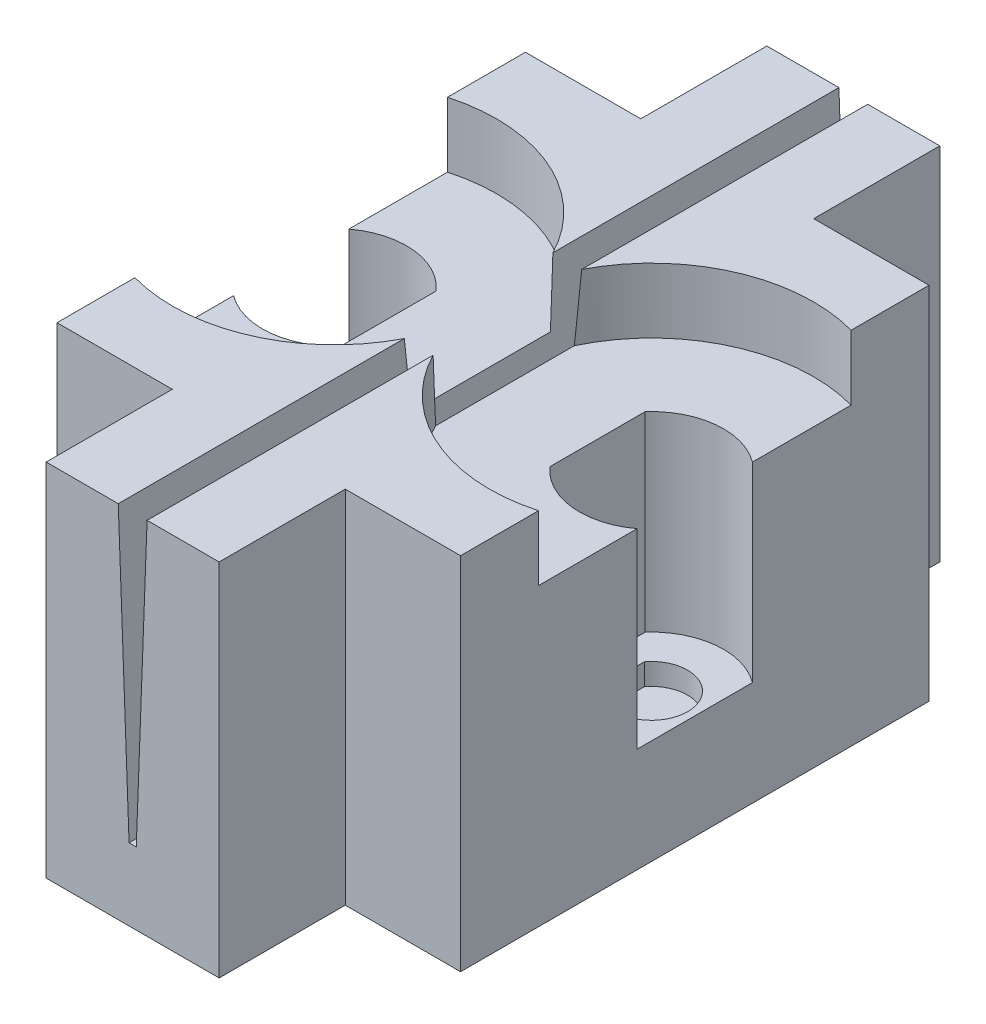
ISO-10303-21;
HEADER;
FILE_DESCRIPTION(('STEP AP214'),'2;1');
FILE_NAME('part.step','',(''),(''),'','','');
FILE_SCHEMA(('AUTOMOTIVE_DESIGN { 1 0 10303 214 1 1 1 1 }'));
ENDSEC;
DATA;
#1=APPLICATION_CONTEXT('core data for automotive mechanical design processes');
#2=APPLICATION_PROTOCOL_DEFINITION('international standard','automotive_design',2000,#1);
#3=PRODUCT_CONTEXT('',#1,'mechanical');
#4=PRODUCT('Part','Part','',(#3));
#5=PRODUCT_RELATED_PRODUCT_CATEGORY('part','',(#4));
#6=PRODUCT_DEFINITION_FORMATION('','',#4);
#7=PRODUCT_DEFINITION_CONTEXT('part definition',#1,'design');
#8=PRODUCT_DEFINITION('design','',#6,#7);
#9=PRODUCT_DEFINITION_SHAPE('','',#8);
#10=(LENGTH_UNIT() NAMED_UNIT(*) SI_UNIT(.MILLI.,.METRE.));
#11=(NAMED_UNIT(*) PLANE_ANGLE_UNIT() SI_UNIT($,.RADIAN.));
#12=(NAMED_UNIT(*) SI_UNIT($,.STERADIAN.) SOLID_ANGLE_UNIT());
#13=UNCERTAINTY_MEASURE_WITH_UNIT(LENGTH_MEASURE(1.E-05),#10,'distance_accuracy_value','');
#14=(GEOMETRIC_REPRESENTATION_CONTEXT(3) GLOBAL_UNCERTAINTY_ASSIGNED_CONTEXT((#13)) GLOBAL_UNIT_ASSIGNED_CONTEXT((#10,
#11,#12)) REPRESENTATION_CONTEXT('',''));
#15=CARTESIAN_POINT('',(0.,0.,0.));
#16=DIRECTION('',(0.,0.,1.));
#17=DIRECTION('',(1.,0.,0.));
#18=AXIS2_PLACEMENT_3D('',#15,#16,#17);
#19=CARTESIAN_POINT('',(-14.5,14.5,-6.61437827766145));
#20=DIRECTION('',(-1.,0.,0.));
#21=DIRECTION('',(0.,0.,1.));
#22=AXIS2_PLACEMENT_3D('',#19,#20,#21);
#23=PLANE('',#22);
#24=DIRECTION('',(0.,1.,0.));
#25=VECTOR('',#24,1.);
#26=CARTESIAN_POINT('',(-14.5,14.5,6.61437827766145));
#27=LINE('',#26,#25);
#28=CARTESIAN_POINT('',(-14.5,14.5,6.61437827766145));
#29=VERTEX_POINT('',#28);
#30=CARTESIAN_POINT('',(-14.5,41.,6.61437827766145));
#31=VERTEX_POINT('',#30);
#32=EDGE_CURVE('E528',#29,#31,#27,.T.);
#33=ORIENTED_EDGE('',*,*,#32,.T.);
#34=DIRECTION('',(0.,0.,-1.));
#35=VECTOR('',#34,1.);
#36=CARTESIAN_POINT('',(-14.5,41.,-6.61437827766145));
#37=LINE('',#36,#35);
#38=CARTESIAN_POINT('',(-14.5,41.,-6.61437827766146));
#39=VERTEX_POINT('',#38);
#40=EDGE_CURVE('E500',#31,#39,#37,.T.);
#41=ORIENTED_EDGE('',*,*,#40,.T.);
#42=DIRECTION('',(0.,1.,0.));
#43=VECTOR('',#42,1.);
#44=CARTESIAN_POINT('',(-14.5,14.5,-6.61437827766145));
#45=LINE('',#44,#43);
#46=CARTESIAN_POINT('',(-14.5,14.5,-6.61437827766145));
#47=VERTEX_POINT('',#46);
#48=EDGE_CURVE('E529',#47,#39,#45,.T.);
#49=ORIENTED_EDGE('',*,*,#48,.F.);
#50=DIRECTION('',(0.,0.,1.));
#51=VECTOR('',#50,1.);
#52=CARTESIAN_POINT('',(-14.5,14.5,-6.61437827766145));
#53=LINE('',#52,#51);
#54=EDGE_CURVE('E526',#47,#29,#53,.T.);
#55=ORIENTED_EDGE('',*,*,#54,.T.);
#56=EDGE_LOOP('',(#33,#41,#49,#55));
#57=FACE_BOUND('',#56,.T.);
#58=ADVANCED_FACE('F35',(#57),#23,.T.);
#59=CARTESIAN_POINT('',(-22.,14.5,0.));
#60=DIRECTION('',(0.,-1.,0.));
#61=DIRECTION('',(0.,0.,-1.));
#62=AXIS2_PLACEMENT_3D('',#59,#60,#61);
#63=PLANE('',#62);
#64=CARTESIAN_POINT('',(-22.,14.5,0.));
#65=DIRECTION('',(0.,-1.,0.));
#66=DIRECTION('',(0.,0.,-1.));
#67=AXIS2_PLACEMENT_3D('',#64,#65,#66);
#68=CIRCLE('',#67,9.99999999999998);
#69=CARTESIAN_POINT('',(-28.,14.5,7.99999999999996));
#70=VERTEX_POINT('',#69);
#71=EDGE_CURVE('E523',#29,#70,#68,.T.);
#72=ORIENTED_EDGE('',*,*,#71,.F.);
#73=ORIENTED_EDGE('',*,*,#54,.F.);
#74=CARTESIAN_POINT('',(-28.,14.5,-7.99999999999999));
#75=VERTEX_POINT('',#74);
#76=EDGE_CURVE('E520',#75,#47,#68,.T.);
#77=ORIENTED_EDGE('',*,*,#76,.F.);
#78=DIRECTION('',(0.,0.,-1.));
#79=VECTOR('',#78,1.);
#80=CARTESIAN_POINT('',(-28.,14.5,50.));
#81=LINE('',#80,#79);
#82=EDGE_CURVE('E11',#70,#75,#81,.T.);
#83=ORIENTED_EDGE('',*,*,#82,.F.);
#84=EDGE_LOOP('',(#72,#73,#77,#83));
#85=FACE_BOUND('',#84,.T.);
#86=CARTESIAN_POINT('',(-22.,14.5,0.));
#87=DIRECTION('',(0.,-1.,0.));
#88=DIRECTION('',(0.,0.,-1.));
#89=AXIS2_PLACEMENT_3D('',#86,#87,#88);
#90=CIRCLE('',#89,5.);
#91=CARTESIAN_POINT('',(-18.,14.5,3.));
#92=VERTEX_POINT('',#91);
#93=CARTESIAN_POINT('',(-18.,14.5,-3.));
#94=VERTEX_POINT('',#93);
#95=EDGE_CURVE('E505',#92,#94,#90,.T.);
#96=ORIENTED_EDGE('',*,*,#95,.T.);
#97=DIRECTION('',(0.,0.,1.));
#98=VECTOR('',#97,1.);
#99=CARTESIAN_POINT('',(-18.,14.5,-3.));
#100=LINE('',#99,#98);
#101=EDGE_CURVE('E510',#94,#92,#100,.T.);
#102=ORIENTED_EDGE('',*,*,#101,.T.);
#103=EDGE_LOOP('',(#96,#102));
#104=FACE_BOUND('',#103,.T.);
#105=ADVANCED_FACE('F548',(#85,#104),#63,.F.);
#106=CARTESIAN_POINT('',(-28.,50.,50.));
#107=DIRECTION('',(1.,0.,0.));
#108=DIRECTION('',(0.,0.,-1.));
#109=AXIS2_PLACEMENT_3D('',#106,#107,#108);
#110=PLANE('',#109);
#111=DIRECTION('',(0.,0.,1.));
#112=VECTOR('',#111,1.);
#113=CARTESIAN_POINT('',(-28.,0.,50.));
#114=LINE('',#113,#112);
#115=CARTESIAN_POINT('',(-28.,0.,-32.5));
#116=VERTEX_POINT('',#115);
#117=CARTESIAN_POINT('',(-28.,0.,32.5));
#118=VERTEX_POINT('',#117);
#119=EDGE_CURVE('E295',#116,#118,#114,.T.);
#120=ORIENTED_EDGE('',*,*,#119,.T.);
#121=DIRECTION('',(0.,1.,0.));
#122=VECTOR('',#121,1.);
#123=CARTESIAN_POINT('',(-28.,0.,32.5));
#124=LINE('',#123,#122);
#125=CARTESIAN_POINT('',(-28.,50.,32.5));
#126=VERTEX_POINT('',#125);
#127=EDGE_CURVE('E469',#118,#126,#124,.T.);
#128=ORIENTED_EDGE('',*,*,#127,.T.);
#129=DIRECTION('',(0.,0.,1.));
#130=VECTOR('',#129,1.);
#131=CARTESIAN_POINT('',(-28.,50.,50.));
#132=LINE('',#131,#130);
#133=CARTESIAN_POINT('',(-28.,50.,21.6852484422014));
#134=VERTEX_POINT('',#133);
#135=EDGE_CURVE('E456',#134,#126,#132,.T.);
#136=ORIENTED_EDGE('',*,*,#135,.F.);
#137=DIRECTION('',(0.,1.,0.));
#138=VECTOR('',#137,1.);
#139=CARTESIAN_POINT('',(-28.,41.,21.6852484422014));
#140=LINE('',#139,#138);
#141=CARTESIAN_POINT('',(-28.,41.,21.6852484422014));
#142=VERTEX_POINT('',#141);
#143=EDGE_CURVE('E364',#142,#134,#140,.T.);
#144=ORIENTED_EDGE('',*,*,#143,.F.);
#145=DIRECTION('',(0.,0.,1.));
#146=VECTOR('',#145,1.);
#147=CARTESIAN_POINT('',(-28.,41.,50.));
#148=LINE('',#147,#146);
#149=CARTESIAN_POINT('',(-28.,41.,7.99999999999996));
#150=VERTEX_POINT('',#149);
#151=EDGE_CURVE('E341',#150,#142,#148,.T.);
#152=ORIENTED_EDGE('',*,*,#151,.F.);
#153=DIRECTION('',(0.,1.,0.));
#154=VECTOR('',#153,1.);
#155=CARTESIAN_POINT('',(-28.,14.5,7.99999999999996));
#156=LINE('',#155,#154);
#157=EDGE_CURVE('E536',#70,#150,#156,.T.);
#158=ORIENTED_EDGE('',*,*,#157,.F.);
#159=ORIENTED_EDGE('',*,*,#82,.T.);
#160=DIRECTION('',(0.,1.,0.));
#161=VECTOR('',#160,1.);
#162=CARTESIAN_POINT('',(-28.,14.5,-7.99999999999999));
#163=LINE('',#162,#161);
#164=CARTESIAN_POINT('',(-28.,41.,-7.99999999999999));
#165=VERTEX_POINT('',#164);
#166=EDGE_CURVE('E532',#165,#75,#163,.F.);
#167=ORIENTED_EDGE('',*,*,#166,.F.);
#168=CARTESIAN_POINT('',(-28.,41.,-21.6852484422015));
#169=VERTEX_POINT('',#168);
#170=EDGE_CURVE('E369',#169,#165,#148,.T.);
#171=ORIENTED_EDGE('',*,*,#170,.F.);
#172=DIRECTION('',(0.,1.,0.));
#173=VECTOR('',#172,1.);
#174=CARTESIAN_POINT('',(-28.,41.,-21.6852484422015));
#175=LINE('',#174,#173);
#176=CARTESIAN_POINT('',(-28.,50.,-21.6852484422015));
#177=VERTEX_POINT('',#176);
#178=EDGE_CURVE('E366',#177,#169,#175,.F.);
#179=ORIENTED_EDGE('',*,*,#178,.F.);
#180=CARTESIAN_POINT('',(-28.,50.,-32.5));
#181=VERTEX_POINT('',#180);
#182=EDGE_CURVE('E359',#181,#177,#132,.T.);
#183=ORIENTED_EDGE('',*,*,#182,.F.);
#184=DIRECTION('',(0.,1.,0.));
#185=VECTOR('',#184,1.);
#186=CARTESIAN_POINT('',(-28.,0.,-32.5));
#187=LINE('',#186,#185);
#188=EDGE_CURVE('E491',#116,#181,#187,.T.);
#189=ORIENTED_EDGE('',*,*,#188,.F.);
#190=EDGE_LOOP('',(#120,#128,#136,#144,#152,#158,#159,#167,#171,#179,#183,#189));
#191=FACE_BOUND('',#190,.T.);
#192=ADVANCED_FACE('F468',(#191),#110,.F.);
#193=CARTESIAN_POINT('',(0.,50.,0.));
#194=DIRECTION('',(0.,-1.,0.));
#195=DIRECTION('',(0.,0.,-1.));
#196=AXIS2_PLACEMENT_3D('',#193,#194,#195);
#197=PLANE('',#196);
#198=ORIENTED_EDGE('',*,*,#135,.T.);
#199=DIRECTION('',(-1.,0.,0.));
#200=VECTOR('',#199,1.);
#201=CARTESIAN_POINT('',(-28.,50.,32.5));
#202=LINE('',#201,#200);
#203=CARTESIAN_POINT('',(-12.,50.,32.5));
#204=VERTEX_POINT('',#203);
#205=EDGE_CURVE('E465',#204,#126,#202,.T.);
#206=ORIENTED_EDGE('',*,*,#205,.F.);
#207=DIRECTION('',(0.,0.,-1.));
#208=VECTOR('',#207,1.);
#209=CARTESIAN_POINT('',(-12.,50.,50.));
#210=LINE('',#209,#208);
#211=CARTESIAN_POINT('',(-12.,50.,50.));
#212=VERTEX_POINT('',#211);
#213=EDGE_CURVE('E562',#212,#204,#210,.T.);
#214=ORIENTED_EDGE('',*,*,#213,.F.);
#215=DIRECTION('',(1.,0.,0.));
#216=VECTOR('',#215,1.);
#217=CARTESIAN_POINT('',(-28.,50.,50.));
#218=LINE('',#217,#216);
#219=CARTESIAN_POINT('',(-2.00000000000001,50.,50.));
#220=VERTEX_POINT('',#219);
#221=EDGE_CURVE('E300',#212,#220,#218,.T.);
#222=ORIENTED_EDGE('',*,*,#221,.T.);
#223=DIRECTION('',(0.,0.,1.));
#224=VECTOR('',#223,1.);
#225=CARTESIAN_POINT('',(-2.00000000000001,50.,-50.));
#226=LINE('',#225,#224);
#227=CARTESIAN_POINT('',(-2.,50.,10.3077640640442));
#228=VERTEX_POINT('',#227);
#229=EDGE_CURVE('E447',#228,#220,#226,.T.);
#230=ORIENTED_EDGE('',*,*,#229,.F.);
#231=CARTESIAN_POINT('',(-22.,50.,0.));
#232=DIRECTION('',(0.,-1.,0.));
#233=DIRECTION('',(0.,0.,1.));
#234=AXIS2_PLACEMENT_3D('',#231,#232,#233);
#235=CIRCLE('',#234,22.5);
#236=EDGE_CURVE('E333',#228,#134,#235,.T.);
#237=ORIENTED_EDGE('',*,*,#236,.T.);
#238=EDGE_LOOP('',(#198,#206,#214,#222,#230,#237));
#239=FACE_BOUND('',#238,.T.);
#240=ADVANCED_FACE('F463',(#239),#197,.F.);
#241=CARTESIAN_POINT('',(14.5,14.5,-6.61437827766145));
#242=DIRECTION('',(-1.,0.,0.));
#243=DIRECTION('',(0.,0.,1.));
#244=AXIS2_PLACEMENT_3D('',#241,#242,#243);
#245=PLANE('',#244);
#246=DIRECTION('',(0.,0.,-1.));
#247=VECTOR('',#246,1.);
#248=CARTESIAN_POINT('',(14.5,41.,-6.61437827766145));
#249=LINE('',#248,#247);
#250=CARTESIAN_POINT('',(14.5,41.,6.61437827766145));
#251=VERTEX_POINT('',#250);
#252=CARTESIAN_POINT('',(14.5,41.,-6.61437827766145));
#253=VERTEX_POINT('',#252);
#254=EDGE_CURVE('E370',#251,#253,#249,.T.);
#255=ORIENTED_EDGE('',*,*,#254,.F.);
#256=DIRECTION('',(0.,1.,0.));
#257=VECTOR('',#256,1.);
#258=CARTESIAN_POINT('',(14.5,14.5,6.61437827766145));
#259=LINE('',#258,#257);
#260=CARTESIAN_POINT('',(14.5,14.5,6.61437827766145));
#261=VERTEX_POINT('',#260);
#262=EDGE_CURVE('E396',#261,#251,#259,.T.);
#263=ORIENTED_EDGE('',*,*,#262,.F.);
#264=DIRECTION('',(0.,0.,1.));
#265=VECTOR('',#264,1.);
#266=CARTESIAN_POINT('',(14.5,14.5,-6.61437827766145));
#267=LINE('',#266,#265);
#268=CARTESIAN_POINT('',(14.5,14.5,-6.61437827766145));
#269=VERTEX_POINT('',#268);
#270=EDGE_CURVE('E392',#269,#261,#267,.T.);
#271=ORIENTED_EDGE('',*,*,#270,.F.);
#272=DIRECTION('',(0.,1.,0.));
#273=VECTOR('',#272,1.);
#274=CARTESIAN_POINT('',(14.5,14.5,-6.61437827766145));
#275=LINE('',#274,#273);
#276=EDGE_CURVE('E395',#269,#253,#275,.T.);
#277=ORIENTED_EDGE('',*,*,#276,.T.);
#278=EDGE_LOOP('',(#255,#263,#271,#277));
#279=FACE_BOUND('',#278,.T.);
#280=ADVANCED_FACE('F657',(#279),#245,.F.);
#281=CARTESIAN_POINT('',(1.99999999999999,50.,50.));
#282=VERTEX_POINT('',#281);
#283=CARTESIAN_POINT('',(12.,50.,50.));
#284=VERTEX_POINT('',#283);
#285=EDGE_CURVE('E457',#282,#284,#218,.T.);
#286=ORIENTED_EDGE('',*,*,#285,.T.);
#287=DIRECTION('',(0.,0.,1.));
#288=VECTOR('',#287,1.);
#289=CARTESIAN_POINT('',(12.,50.,50.));
#290=LINE('',#289,#288);
#291=CARTESIAN_POINT('',(12.,50.,32.5));
#292=VERTEX_POINT('',#291);
#293=EDGE_CURVE('E279',#292,#284,#290,.T.);
#294=ORIENTED_EDGE('',*,*,#293,.F.);
#295=DIRECTION('',(-1.,0.,0.));
#296=VECTOR('',#295,1.);
#297=CARTESIAN_POINT('',(28.,50.,32.5));
#298=LINE('',#297,#296);
#299=CARTESIAN_POINT('',(28.,50.,32.5));
#300=VERTEX_POINT('',#299);
#301=EDGE_CURVE('E891',#300,#292,#298,.T.);
#302=ORIENTED_EDGE('',*,*,#301,.F.);
#303=DIRECTION('',(0.,0.,-1.));
#304=VECTOR('',#303,1.);
#305=CARTESIAN_POINT('',(28.,50.,50.));
#306=LINE('',#305,#304);
#307=CARTESIAN_POINT('',(28.,50.,21.6852484422014));
#308=VERTEX_POINT('',#307);
#309=EDGE_CURVE('E287',#300,#308,#306,.T.);
#310=ORIENTED_EDGE('',*,*,#309,.T.);
#311=CARTESIAN_POINT('',(22.,50.,0.));
#312=DIRECTION('',(0.,1.,0.));
#313=DIRECTION('',(0.,0.,1.));
#314=AXIS2_PLACEMENT_3D('',#311,#312,#313);
#315=CIRCLE('',#314,22.5);
#316=CARTESIAN_POINT('',(1.99999999999999,50.,10.3077640640442));
#317=VERTEX_POINT('',#316);
#318=EDGE_CURVE('E411',#317,#308,#315,.T.);
#319=ORIENTED_EDGE('',*,*,#318,.F.);
#320=DIRECTION('',(0.,0.,1.));
#321=VECTOR('',#320,1.);
#322=CARTESIAN_POINT('',(1.99999999999999,50.,-50.));
#323=LINE('',#322,#321);
#324=EDGE_CURVE('E451',#317,#282,#323,.T.);
#325=ORIENTED_EDGE('',*,*,#324,.T.);
#326=EDGE_LOOP('',(#286,#294,#302,#310,#319,#325));
#327=FACE_BOUND('',#326,.T.);
#328=ADVANCED_FACE('F660',(#327),#197,.F.);
#329=DIRECTION('',(-1.,0.,0.));
#330=VECTOR('',#329,1.);
#331=CARTESIAN_POINT('',(-28.,50.,-50.));
#332=LINE('',#331,#330);
#333=CARTESIAN_POINT('',(-2.00000000000001,50.,-50.));
#334=VERTEX_POINT('',#333);
#335=CARTESIAN_POINT('',(-12.,50.,-50.));
#336=VERTEX_POINT('',#335);
#337=EDGE_CURVE('E454',#334,#336,#332,.T.);
#338=ORIENTED_EDGE('',*,*,#337,.T.);
#339=DIRECTION('',(0.,0.,-1.));
#340=VECTOR('',#339,1.);
#341=CARTESIAN_POINT('',(-12.,50.,-50.));
#342=LINE('',#341,#340);
#343=CARTESIAN_POINT('',(-12.,50.,-32.5));
#344=VERTEX_POINT('',#343);
#345=EDGE_CURVE('E488',#344,#336,#342,.T.);
#346=ORIENTED_EDGE('',*,*,#345,.F.);
#347=DIRECTION('',(1.,0.,0.));
#348=VECTOR('',#347,1.);
#349=CARTESIAN_POINT('',(-28.,50.,-32.5));
#350=LINE('',#349,#348);
#351=EDGE_CURVE('E492',#181,#344,#350,.T.);
#352=ORIENTED_EDGE('',*,*,#351,.F.);
#353=ORIENTED_EDGE('',*,*,#182,.T.);
#354=CARTESIAN_POINT('',(-2.,50.,-10.3077640640442));
#355=VERTEX_POINT('',#354);
#356=EDGE_CURVE('E343',#177,#355,#235,.T.);
#357=ORIENTED_EDGE('',*,*,#356,.T.);
#358=EDGE_CURVE('E297',#334,#355,#226,.T.);
#359=ORIENTED_EDGE('',*,*,#358,.F.);
#360=EDGE_LOOP('',(#338,#346,#352,#353,#357,#359));
#361=FACE_BOUND('',#360,.T.);
#362=ADVANCED_FACE('F355',(#361),#197,.F.);
#363=CARTESIAN_POINT('',(28.,50.,50.));
#364=DIRECTION('',(-1.,0.,0.));
#365=DIRECTION('',(0.,0.,1.));
#366=AXIS2_PLACEMENT_3D('',#363,#364,#365);
#367=PLANE('',#366);
#368=DIRECTION('',(0.,0.,-1.));
#369=VECTOR('',#368,1.);
#370=CARTESIAN_POINT('',(28.,0.,50.));
#371=LINE('',#370,#369);
#372=CARTESIAN_POINT('',(28.,0.,32.5));
#373=VERTEX_POINT('',#372);
#374=CARTESIAN_POINT('',(28.,0.,-32.5));
#375=VERTEX_POINT('',#374);
#376=EDGE_CURVE('E285',#373,#375,#371,.T.);
#377=ORIENTED_EDGE('',*,*,#376,.T.);
#378=DIRECTION('',(0.,1.,0.));
#379=VECTOR('',#378,1.);
#380=CARTESIAN_POINT('',(28.,0.,-32.5));
#381=LINE('',#380,#379);
#382=CARTESIAN_POINT('',(28.,50.,-32.5));
#383=VERTEX_POINT('',#382);
#384=EDGE_CURVE('E495',#375,#383,#381,.T.);
#385=ORIENTED_EDGE('',*,*,#384,.T.);
#386=CARTESIAN_POINT('',(28.,50.,-21.6852484422015));
#387=VERTEX_POINT('',#386);
#388=EDGE_CURVE('E308',#387,#383,#306,.T.);
#389=ORIENTED_EDGE('',*,*,#388,.F.);
#390=DIRECTION('',(0.,1.,0.));
#391=VECTOR('',#390,1.);
#392=CARTESIAN_POINT('',(28.,41.,-21.6852484422015));
#393=LINE('',#392,#391);
#394=CARTESIAN_POINT('',(28.,41.,-21.6852484422015));
#395=VERTEX_POINT('',#394);
#396=EDGE_CURVE('E422',#387,#395,#393,.F.);
#397=ORIENTED_EDGE('',*,*,#396,.T.);
#398=DIRECTION('',(0.,0.,-1.));
#399=VECTOR('',#398,1.);
#400=CARTESIAN_POINT('',(28.,41.,50.));
#401=LINE('',#400,#399);
#402=CARTESIAN_POINT('',(28.,41.,-7.99999999999999));
#403=VERTEX_POINT('',#402);
#404=EDGE_CURVE('E419',#403,#395,#401,.T.);
#405=ORIENTED_EDGE('',*,*,#404,.F.);
#406=DIRECTION('',(0.,1.,0.));
#407=VECTOR('',#406,1.);
#408=CARTESIAN_POINT('',(28.,14.5,-7.99999999999999));
#409=LINE('',#408,#407);
#410=CARTESIAN_POINT('',(28.,14.5,-7.99999999999999));
#411=VERTEX_POINT('',#410);
#412=EDGE_CURVE('E399',#403,#411,#409,.F.);
#413=ORIENTED_EDGE('',*,*,#412,.T.);
#414=DIRECTION('',(0.,0.,1.));
#415=VECTOR('',#414,1.);
#416=CARTESIAN_POINT('',(28.,14.5,50.));
#417=LINE('',#416,#415);
#418=CARTESIAN_POINT('',(28.,14.5,7.99999999999996));
#419=VERTEX_POINT('',#418);
#420=EDGE_CURVE('E315',#411,#419,#417,.T.);
#421=ORIENTED_EDGE('',*,*,#420,.T.);
#422=DIRECTION('',(0.,1.,0.));
#423=VECTOR('',#422,1.);
#424=CARTESIAN_POINT('',(28.,14.5,7.99999999999996));
#425=LINE('',#424,#423);
#426=CARTESIAN_POINT('',(28.,41.,7.99999999999996));
#427=VERTEX_POINT('',#426);
#428=EDGE_CURVE('E404',#419,#427,#425,.T.);
#429=ORIENTED_EDGE('',*,*,#428,.T.);
#430=CARTESIAN_POINT('',(28.,41.,21.6852484422014));
#431=VERTEX_POINT('',#430);
#432=EDGE_CURVE('E421',#431,#427,#401,.T.);
#433=ORIENTED_EDGE('',*,*,#432,.F.);
#434=DIRECTION('',(0.,1.,0.));
#435=VECTOR('',#434,1.);
#436=CARTESIAN_POINT('',(28.,41.,21.6852484422014));
#437=LINE('',#436,#435);
#438=EDGE_CURVE('E425',#431,#308,#437,.T.);
#439=ORIENTED_EDGE('',*,*,#438,.T.);
#440=ORIENTED_EDGE('',*,*,#309,.F.);
#441=DIRECTION('',(0.,1.,0.));
#442=VECTOR('',#441,1.);
#443=CARTESIAN_POINT('',(28.,0.,32.5));
#444=LINE('',#443,#442);
#445=EDGE_CURVE('E272',#373,#300,#444,.T.);
#446=ORIENTED_EDGE('',*,*,#445,.F.);
#447=EDGE_LOOP('',(#377,#385,#389,#397,#405,#413,#421,#429,#433,#439,#440,#446));
#448=FACE_BOUND('',#447,.T.);
#449=ADVANCED_FACE('F37',(#448),#367,.F.);
#450=CARTESIAN_POINT('',(-28.,50.,-50.));
#451=DIRECTION('',(0.,0.,1.));
#452=DIRECTION('',(1.,0.,0.));
#453=AXIS2_PLACEMENT_3D('',#450,#451,#452);
#454=PLANE('',#453);
#455=CARTESIAN_POINT('',(12.,50.,-50.));
#456=VERTEX_POINT('',#455);
#457=CARTESIAN_POINT('',(1.99999999999999,50.,-50.));
#458=VERTEX_POINT('',#457);
#459=EDGE_CURVE('E455',#456,#458,#332,.T.);
#460=ORIENTED_EDGE('',*,*,#459,.F.);
#461=DIRECTION('',(0.,1.,0.));
#462=VECTOR('',#461,1.);
#463=CARTESIAN_POINT('',(12.,0.,-50.));
#464=LINE('',#463,#462);
#465=CARTESIAN_POINT('',(12.,0.,-50.));
#466=VERTEX_POINT('',#465);
#467=EDGE_CURVE('E576',#466,#456,#464,.T.);
#468=ORIENTED_EDGE('',*,*,#467,.F.);
#469=DIRECTION('',(-1.,0.,0.));
#470=VECTOR('',#469,1.);
#471=CARTESIAN_POINT('',(-28.,0.,-50.));
#472=LINE('',#471,#470);
#473=CARTESIAN_POINT('',(-12.,0.,-50.));
#474=VERTEX_POINT('',#473);
#475=EDGE_CURVE('E291',#466,#474,#472,.T.);
#476=ORIENTED_EDGE('',*,*,#475,.T.);
#477=DIRECTION('',(0.,1.,0.));
#478=VECTOR('',#477,1.);
#479=CARTESIAN_POINT('',(-12.,0.,-50.));
#480=LINE('',#479,#478);
#481=EDGE_CURVE('E497',#474,#336,#480,.T.);
#482=ORIENTED_EDGE('',*,*,#481,.T.);
#483=ORIENTED_EDGE('',*,*,#337,.F.);
#484=DIRECTION('',(0.0374736605890944,-0.999297615709181,0.));
#485=VECTOR('',#484,1.);
#486=CARTESIAN_POINT('',(-0.5,10.,-50.));
#487=LINE('',#486,#485);
#488=CARTESIAN_POINT('',(-0.5,10.,-50.));
#489=VERTEX_POINT('',#488);
#490=EDGE_CURVE('E435',#334,#489,#487,.T.);
#491=ORIENTED_EDGE('',*,*,#490,.T.);
#492=DIRECTION('',(1.,0.,0.));
#493=VECTOR('',#492,1.);
#494=CARTESIAN_POINT('',(-0.5,10.,-50.));
#495=LINE('',#494,#493);
#496=CARTESIAN_POINT('',(0.5,10.,-50.));
#497=VERTEX_POINT('',#496);
#498=EDGE_CURVE('E428',#489,#497,#495,.T.);
#499=ORIENTED_EDGE('',*,*,#498,.T.);
#500=DIRECTION('',(0.0374736605890941,0.999297615709181,0.));
#501=VECTOR('',#500,1.);
#502=CARTESIAN_POINT('',(1.99999999999999,50.,-50.));
#503=LINE('',#502,#501);
#504=EDGE_CURVE('E431',#497,#458,#503,.T.);
#505=ORIENTED_EDGE('',*,*,#504,.T.);
#506=EDGE_LOOP('',(#460,#468,#476,#482,#483,#491,#499,#505));
#507=FACE_BOUND('',#506,.T.);
#508=ADVANCED_FACE('F593',(#507),#454,.F.);
#509=CARTESIAN_POINT('',(-28.,50.,50.));
#510=DIRECTION('',(0.,0.,-1.));
#511=DIRECTION('',(-1.,0.,0.));
#512=AXIS2_PLACEMENT_3D('',#509,#510,#511);
#513=PLANE('',#512);
#514=ORIENTED_EDGE('',*,*,#221,.F.);
#515=DIRECTION('',(0.,1.,0.));
#516=VECTOR('',#515,1.);
#517=CARTESIAN_POINT('',(-12.,0.,50.));
#518=LINE('',#517,#516);
#519=CARTESIAN_POINT('',(-12.,0.,50.));
#520=VERTEX_POINT('',#519);
#521=EDGE_CURVE('E478',#520,#212,#518,.T.);
#522=ORIENTED_EDGE('',*,*,#521,.F.);
#523=DIRECTION('',(1.,0.,0.));
#524=VECTOR('',#523,1.);
#525=CARTESIAN_POINT('',(-28.,0.,50.));
#526=LINE('',#525,#524);
#527=CARTESIAN_POINT('',(12.,0.,50.));
#528=VERTEX_POINT('',#527);
#529=EDGE_CURVE('E305',#520,#528,#526,.T.);
#530=ORIENTED_EDGE('',*,*,#529,.T.);
#531=DIRECTION('',(0.,1.,0.));
#532=VECTOR('',#531,1.);
#533=CARTESIAN_POINT('',(12.,0.,50.));
#534=LINE('',#533,#532);
#535=EDGE_CURVE('E564',#528,#284,#534,.T.);
#536=ORIENTED_EDGE('',*,*,#535,.T.);
#537=ORIENTED_EDGE('',*,*,#285,.F.);
#538=DIRECTION('',(0.0374736605890941,0.999297615709181,0.));
#539=VECTOR('',#538,1.);
#540=CARTESIAN_POINT('',(1.99999999999999,50.,50.));
#541=LINE('',#540,#539);
#542=CARTESIAN_POINT('',(0.5,10.,50.));
#543=VERTEX_POINT('',#542);
#544=EDGE_CURVE('E441',#543,#282,#541,.T.);
#545=ORIENTED_EDGE('',*,*,#544,.F.);
#546=DIRECTION('',(1.,0.,0.));
#547=VECTOR('',#546,1.);
#548=CARTESIAN_POINT('',(-0.5,10.,50.));
#549=LINE('',#548,#547);
#550=CARTESIAN_POINT('',(-0.5,10.,50.));
#551=VERTEX_POINT('',#550);
#552=EDGE_CURVE('E427',#551,#543,#549,.T.);
#553=ORIENTED_EDGE('',*,*,#552,.F.);
#554=DIRECTION('',(0.0374736605890944,-0.999297615709181,0.));
#555=VECTOR('',#554,1.);
#556=CARTESIAN_POINT('',(-0.5,10.,50.));
#557=LINE('',#556,#555);
#558=EDGE_CURVE('E432',#220,#551,#557,.T.);
#559=ORIENTED_EDGE('',*,*,#558,.F.);
#560=EDGE_LOOP('',(#514,#522,#530,#536,#537,#545,#553,#559));
#561=FACE_BOUND('',#560,.T.);
#562=ADVANCED_FACE('F683',(#561),#513,.F.);
#563=ORIENTED_EDGE('',*,*,#388,.T.);
#564=DIRECTION('',(1.,0.,0.));
#565=VECTOR('',#564,1.);
#566=CARTESIAN_POINT('',(28.,50.,-32.5));
#567=LINE('',#566,#565);
#568=CARTESIAN_POINT('',(12.,50.,-32.5));
#569=VERTEX_POINT('',#568);
#570=EDGE_CURVE('E476',#569,#383,#567,.T.);
#571=ORIENTED_EDGE('',*,*,#570,.F.);
#572=DIRECTION('',(0.,0.,1.));
#573=VECTOR('',#572,1.);
#574=CARTESIAN_POINT('',(12.,50.,-50.));
#575=LINE('',#574,#573);
#576=EDGE_CURVE('E472',#456,#569,#575,.T.);
#577=ORIENTED_EDGE('',*,*,#576,.F.);
#578=ORIENTED_EDGE('',*,*,#459,.T.);
#579=CARTESIAN_POINT('',(1.99999999999999,50.,-10.3077640640442));
#580=VERTEX_POINT('',#579);
#581=EDGE_CURVE('E448',#458,#580,#323,.T.);
#582=ORIENTED_EDGE('',*,*,#581,.T.);
#583=EDGE_CURVE('E416',#387,#580,#315,.T.);
#584=ORIENTED_EDGE('',*,*,#583,.F.);
#585=EDGE_LOOP('',(#563,#571,#577,#578,#582,#584));
#586=FACE_BOUND('',#585,.T.);
#587=ADVANCED_FACE('F591',(#586),#197,.F.);
#588=CARTESIAN_POINT('',(0.,0.,0.));
#589=DIRECTION('',(0.,-1.,0.));
#590=DIRECTION('',(0.,0.,-1.));
#591=AXIS2_PLACEMENT_3D('',#588,#589,#590);
#592=PLANE('',#591);
#593=DIRECTION('',(1.,0.,0.));
#594=VECTOR('',#593,1.);
#595=CARTESIAN_POINT('',(28.,0.,-32.5));
#596=LINE('',#595,#594);
#597=CARTESIAN_POINT('',(12.,0.,-32.5));
#598=VERTEX_POINT('',#597);
#599=EDGE_CURVE('E50',#598,#375,#596,.T.);
#600=ORIENTED_EDGE('',*,*,#599,.T.);
#601=ORIENTED_EDGE('',*,*,#376,.F.);
#602=DIRECTION('',(-1.,0.,0.));
#603=VECTOR('',#602,1.);
#604=CARTESIAN_POINT('',(28.,0.,32.5));
#605=LINE('',#604,#603);
#606=CARTESIAN_POINT('',(12.,0.,32.5));
#607=VERTEX_POINT('',#606);
#608=EDGE_CURVE('E268',#373,#607,#605,.T.);
#609=ORIENTED_EDGE('',*,*,#608,.T.);
#610=DIRECTION('',(0.,0.,1.));
#611=VECTOR('',#610,1.);
#612=CARTESIAN_POINT('',(12.,0.,50.));
#613=LINE('',#612,#611);
#614=EDGE_CURVE('E278',#607,#528,#613,.T.);
#615=ORIENTED_EDGE('',*,*,#614,.T.);
#616=ORIENTED_EDGE('',*,*,#529,.F.);
#617=DIRECTION('',(0.,0.,-1.));
#618=VECTOR('',#617,1.);
#619=CARTESIAN_POINT('',(-12.,0.,50.));
#620=LINE('',#619,#618);
#621=CARTESIAN_POINT('',(-12.,0.,32.5));
#622=VERTEX_POINT('',#621);
#623=EDGE_CURVE('E558',#520,#622,#620,.T.);
#624=ORIENTED_EDGE('',*,*,#623,.T.);
#625=DIRECTION('',(-1.,0.,0.));
#626=VECTOR('',#625,1.);
#627=CARTESIAN_POINT('',(-28.,0.,32.5));
#628=LINE('',#627,#626);
#629=EDGE_CURVE('E58',#622,#118,#628,.T.);
#630=ORIENTED_EDGE('',*,*,#629,.T.);
#631=ORIENTED_EDGE('',*,*,#119,.F.);
#632=DIRECTION('',(1.,0.,0.));
#633=VECTOR('',#632,1.);
#634=CARTESIAN_POINT('',(-28.,0.,-32.5));
#635=LINE('',#634,#633);
#636=CARTESIAN_POINT('',(-12.,0.,-32.5));
#637=VERTEX_POINT('',#636);
#638=EDGE_CURVE('E484',#116,#637,#635,.T.);
#639=ORIENTED_EDGE('',*,*,#638,.T.);
#640=DIRECTION('',(0.,0.,-1.));
#641=VECTOR('',#640,1.);
#642=CARTESIAN_POINT('',(-12.,0.,-50.));
#643=LINE('',#642,#641);
#644=EDGE_CURVE('E487',#637,#474,#643,.T.);
#645=ORIENTED_EDGE('',*,*,#644,.T.);
#646=ORIENTED_EDGE('',*,*,#475,.F.);
#647=DIRECTION('',(0.,0.,1.));
#648=VECTOR('',#647,1.);
#649=CARTESIAN_POINT('',(12.,0.,-50.));
#650=LINE('',#649,#648);
#651=EDGE_CURVE('E574',#466,#598,#650,.T.);
#652=ORIENTED_EDGE('',*,*,#651,.T.);
#653=EDGE_LOOP('',(#600,#601,#609,#615,#616,#624,#630,#631,#639,#645,#646,#652));
#654=FACE_BOUND('',#653,.T.);
#655=ADVANCED_FACE('F289',(#654),#592,.T.);
#656=CARTESIAN_POINT('',(-0.5,10.,-50.));
#657=DIRECTION('',(0.,-1.,0.));
#658=DIRECTION('',(0.,0.,-1.));
#659=AXIS2_PLACEMENT_3D('',#656,#657,#658);
#660=PLANE('',#659);
#661=ORIENTED_EDGE('',*,*,#552,.T.);
#662=DIRECTION('',(0.,0.,1.));
#663=VECTOR('',#662,1.);
#664=CARTESIAN_POINT('',(0.5,10.,-50.));
#665=LINE('',#664,#663);
#666=EDGE_CURVE('E438',#497,#543,#665,.T.);
#667=ORIENTED_EDGE('',*,*,#666,.F.);
#668=ORIENTED_EDGE('',*,*,#498,.F.);
#669=DIRECTION('',(0.,0.,1.));
#670=VECTOR('',#669,1.);
#671=CARTESIAN_POINT('',(-0.5,10.,-50.));
#672=LINE('',#671,#670);
#673=EDGE_CURVE('E292',#489,#551,#672,.T.);
#674=ORIENTED_EDGE('',*,*,#673,.T.);
#675=EDGE_LOOP('',(#661,#667,#668,#674));
#676=FACE_BOUND('',#675,.T.);
#677=ADVANCED_FACE('F675',(#676),#660,.F.);
#678=CARTESIAN_POINT('',(-0.5,10.,-50.));
#679=DIRECTION('',(-0.999297615709181,-0.0374736605890944,0.));
#680=DIRECTION('',(0.0374736605890944,-0.999297615709181,0.));
#681=AXIS2_PLACEMENT_3D('',#678,#679,#680);
#682=PLANE('',#681);
#683=CARTESIAN_POINT('',(-22.,583.333333333331,0.));
#684=DIRECTION('',(-0.999297615709181,-0.0374736605890944,0.));
#685=DIRECTION('',(-0.0374736605890944,0.999297615709181,0.));
#686=AXIS2_PLACEMENT_3D('',#683,#684,#685);
#687=ELLIPSE('',#686,600.421726788761,22.5);
#688=CARTESIAN_POINT('',(-1.6625,41.,9.62476460751121));
#689=VERTEX_POINT('',#688);
#690=EDGE_CURVE('E43',#228,#689,#687,.F.);
#691=ORIENTED_EDGE('',*,*,#690,.F.);
#692=ORIENTED_EDGE('',*,*,#229,.T.);
#693=ORIENTED_EDGE('',*,*,#558,.T.);
#694=ORIENTED_EDGE('',*,*,#673,.F.);
#695=ORIENTED_EDGE('',*,*,#490,.F.);
#696=ORIENTED_EDGE('',*,*,#358,.T.);
#697=CARTESIAN_POINT('',(-1.6625,41.,-9.62476460751124));
#698=VERTEX_POINT('',#697);
#699=EDGE_CURVE('E318',#698,#355,#687,.F.);
#700=ORIENTED_EDGE('',*,*,#699,.F.);
#701=DIRECTION('',(0.,0.,-1.));
#702=VECTOR('',#701,1.);
#703=CARTESIAN_POINT('',(-1.6625,41.,-50.));
#704=LINE('',#703,#702);
#705=EDGE_CURVE('E319',#689,#698,#704,.T.);
#706=ORIENTED_EDGE('',*,*,#705,.F.);
#707=EDGE_LOOP('',(#691,#692,#693,#694,#695,#696,#700,#706));
#708=FACE_BOUND('',#707,.T.);
#709=ADVANCED_FACE('F345',(#708),#682,.F.);
#710=CARTESIAN_POINT('',(1.99999999999999,50.,-50.));
#711=DIRECTION('',(0.999297615709181,-0.0374736605890941,0.));
#712=DIRECTION('',(0.0374736605890941,0.999297615709181,0.));
#713=AXIS2_PLACEMENT_3D('',#710,#711,#712);
#714=PLANE('',#713);
#715=ORIENTED_EDGE('',*,*,#324,.F.);
#716=CARTESIAN_POINT('',(22.,583.333333333336,0.));
#717=DIRECTION('',(0.999297615709181,-0.0374736605890941,0.));
#718=DIRECTION('',(0.0374736605890941,0.999297615709181,0.));
#719=AXIS2_PLACEMENT_3D('',#716,#717,#718);
#720=ELLIPSE('',#719,600.421726788765,22.5);
#721=CARTESIAN_POINT('',(1.6625,41.,9.6247646075112));
#722=VERTEX_POINT('',#721);
#723=EDGE_CURVE('E314',#317,#722,#720,.T.);
#724=ORIENTED_EDGE('',*,*,#723,.T.);
#725=DIRECTION('',(0.,0.,1.));
#726=VECTOR('',#725,1.);
#727=CARTESIAN_POINT('',(1.6625,41.,-50.));
#728=LINE('',#727,#726);
#729=CARTESIAN_POINT('',(1.6625,41.,-9.62476460751122));
#730=VERTEX_POINT('',#729);
#731=EDGE_CURVE('E309',#730,#722,#728,.T.);
#732=ORIENTED_EDGE('',*,*,#731,.F.);
#733=EDGE_CURVE('E311',#730,#580,#720,.T.);
#734=ORIENTED_EDGE('',*,*,#733,.T.);
#735=ORIENTED_EDGE('',*,*,#581,.F.);
#736=ORIENTED_EDGE('',*,*,#504,.F.);
#737=ORIENTED_EDGE('',*,*,#666,.T.);
#738=ORIENTED_EDGE('',*,*,#544,.T.);
#739=EDGE_LOOP('',(#715,#724,#732,#734,#735,#736,#737,#738));
#740=FACE_BOUND('',#739,.T.);
#741=ADVANCED_FACE('F598',(#740),#714,.F.);
#742=CARTESIAN_POINT('',(22.,41.,0.));
#743=DIRECTION('',(0.,1.,0.));
#744=DIRECTION('',(0.,0.,1.));
#745=AXIS2_PLACEMENT_3D('',#742,#743,#744);
#746=CYLINDRICAL_SURFACE('',#745,22.5);
#747=CARTESIAN_POINT('',(22.,41.,0.));
#748=DIRECTION('',(0.,1.,0.));
#749=DIRECTION('',(0.,0.,1.));
#750=AXIS2_PLACEMENT_3D('',#747,#748,#749);
#751=CIRCLE('',#750,22.5);
#752=EDGE_CURVE('E412',#722,#431,#751,.T.);
#753=ORIENTED_EDGE('',*,*,#752,.F.);
#754=ORIENTED_EDGE('',*,*,#723,.F.);
#755=ORIENTED_EDGE('',*,*,#318,.T.);
#756=ORIENTED_EDGE('',*,*,#438,.F.);
#757=EDGE_LOOP('',(#753,#754,#755,#756));
#758=FACE_BOUND('',#757,.T.);
#759=ADVANCED_FACE('F669',(#758),#746,.F.);
#760=ORIENTED_EDGE('',*,*,#583,.T.);
#761=ORIENTED_EDGE('',*,*,#733,.F.);
#762=EDGE_CURVE('E415',#395,#730,#751,.T.);
#763=ORIENTED_EDGE('',*,*,#762,.F.);
#764=ORIENTED_EDGE('',*,*,#396,.F.);
#765=EDGE_LOOP('',(#760,#761,#763,#764));
#766=FACE_BOUND('',#765,.T.);
#767=ADVANCED_FACE('F667',(#766),#746,.F.);
#768=CARTESIAN_POINT('',(22.,41.,0.));
#769=DIRECTION('',(0.,1.,0.));
#770=DIRECTION('',(0.,0.,1.));
#771=AXIS2_PLACEMENT_3D('',#768,#769,#770);
#772=PLANE('',#771);
#773=ORIENTED_EDGE('',*,*,#432,.T.);
#774=CARTESIAN_POINT('',(22.,41.,0.));
#775=DIRECTION('',(0.,1.,0.));
#776=DIRECTION('',(0.,0.,1.));
#777=AXIS2_PLACEMENT_3D('',#774,#775,#776);
#778=CIRCLE('',#777,9.99999999999998);
#779=EDGE_CURVE('E407',#251,#427,#778,.T.);
#780=ORIENTED_EDGE('',*,*,#779,.F.);
#781=ORIENTED_EDGE('',*,*,#254,.T.);
#782=EDGE_CURVE('E408',#403,#253,#778,.T.);
#783=ORIENTED_EDGE('',*,*,#782,.F.);
#784=ORIENTED_EDGE('',*,*,#404,.T.);
#785=ORIENTED_EDGE('',*,*,#762,.T.);
#786=ORIENTED_EDGE('',*,*,#731,.T.);
#787=ORIENTED_EDGE('',*,*,#752,.T.);
#788=EDGE_LOOP('',(#773,#780,#781,#783,#784,#785,#786,#787));
#789=FACE_BOUND('',#788,.T.);
#790=ADVANCED_FACE('F655',(#789),#772,.T.);
#791=CARTESIAN_POINT('',(22.,14.5,0.));
#792=DIRECTION('',(0.,-1.,0.));
#793=DIRECTION('',(0.,0.,-1.));
#794=AXIS2_PLACEMENT_3D('',#791,#792,#793);
#795=PLANE('',#794);
#796=DIRECTION('',(0.,0.,1.));
#797=VECTOR('',#796,1.);
#798=CARTESIAN_POINT('',(18.,14.5,-3.));
#799=LINE('',#798,#797);
#800=CARTESIAN_POINT('',(18.,14.5,-3.));
#801=VERTEX_POINT('',#800);
#802=CARTESIAN_POINT('',(18.,14.5,3.));
#803=VERTEX_POINT('',#802);
#804=EDGE_CURVE('E377',#801,#803,#799,.T.);
#805=ORIENTED_EDGE('',*,*,#804,.F.);
#806=CARTESIAN_POINT('',(22.,14.5,0.));
#807=DIRECTION('',(0.,1.,0.));
#808=DIRECTION('',(0.,0.,-1.));
#809=AXIS2_PLACEMENT_3D('',#806,#807,#808);
#810=CIRCLE('',#809,5.);
#811=EDGE_CURVE('E372',#803,#801,#810,.T.);
#812=ORIENTED_EDGE('',*,*,#811,.F.);
#813=EDGE_LOOP('',(#805,#812));
#814=FACE_BOUND('',#813,.T.);
#815=CARTESIAN_POINT('',(22.,14.5,0.));
#816=DIRECTION('',(0.,1.,0.));
#817=DIRECTION('',(0.,0.,-1.));
#818=AXIS2_PLACEMENT_3D('',#815,#816,#817);
#819=CIRCLE('',#818,9.99999999999998);
#820=EDGE_CURVE('E386',#411,#269,#819,.T.);
#821=ORIENTED_EDGE('',*,*,#820,.T.);
#822=ORIENTED_EDGE('',*,*,#270,.T.);
#823=EDGE_CURVE('E389',#261,#419,#819,.T.);
#824=ORIENTED_EDGE('',*,*,#823,.T.);
#825=ORIENTED_EDGE('',*,*,#420,.F.);
#826=EDGE_LOOP('',(#821,#822,#824,#825));
#827=FACE_BOUND('',#826,.T.);
#828=ADVANCED_FACE('F651',(#814,#827),#795,.F.);
#829=CARTESIAN_POINT('',(22.,14.5,0.));
#830=DIRECTION('',(0.,1.,0.));
#831=DIRECTION('',(0.,0.,1.));
#832=AXIS2_PLACEMENT_3D('',#829,#830,#831);
#833=CYLINDRICAL_SURFACE('',#832,9.99999999999998);
#834=ORIENTED_EDGE('',*,*,#823,.F.);
#835=ORIENTED_EDGE('',*,*,#262,.T.);
#836=ORIENTED_EDGE('',*,*,#779,.T.);
#837=ORIENTED_EDGE('',*,*,#428,.F.);
#838=EDGE_LOOP('',(#834,#835,#836,#837));
#839=FACE_BOUND('',#838,.T.);
#840=ADVANCED_FACE('F654',(#839),#833,.F.);
#841=ORIENTED_EDGE('',*,*,#782,.T.);
#842=ORIENTED_EDGE('',*,*,#276,.F.);
#843=ORIENTED_EDGE('',*,*,#820,.F.);
#844=ORIENTED_EDGE('',*,*,#412,.F.);
#845=EDGE_LOOP('',(#841,#842,#843,#844));
#846=FACE_BOUND('',#845,.T.);
#847=ADVANCED_FACE('F649',(#846),#833,.F.);
#848=CARTESIAN_POINT('',(22.,11.5,0.));
#849=DIRECTION('',(0.,1.,0.));
#850=DIRECTION('',(0.,0.,1.));
#851=AXIS2_PLACEMENT_3D('',#848,#849,#850);
#852=CYLINDRICAL_SURFACE('',#851,5.);
#853=ORIENTED_EDGE('',*,*,#811,.T.);
#854=DIRECTION('',(0.,1.,0.));
#855=VECTOR('',#854,1.);
#856=CARTESIAN_POINT('',(18.,11.5,-3.));
#857=LINE('',#856,#855);
#858=CARTESIAN_POINT('',(18.,11.5,-3.));
#859=VERTEX_POINT('',#858);
#860=EDGE_CURVE('E380',#859,#801,#857,.T.);
#861=ORIENTED_EDGE('',*,*,#860,.F.);
#862=CARTESIAN_POINT('',(22.,11.5,0.));
#863=DIRECTION('',(0.,1.,0.));
#864=DIRECTION('',(0.,0.,-1.));
#865=AXIS2_PLACEMENT_3D('',#862,#863,#864);
#866=CIRCLE('',#865,5.);
#867=CARTESIAN_POINT('',(18.,11.5,3.));
#868=VERTEX_POINT('',#867);
#869=EDGE_CURVE('E373',#868,#859,#866,.T.);
#870=ORIENTED_EDGE('',*,*,#869,.F.);
#871=DIRECTION('',(0.,1.,0.));
#872=VECTOR('',#871,1.);
#873=CARTESIAN_POINT('',(18.,11.5,3.));
#874=LINE('',#873,#872);
#875=EDGE_CURVE('E384',#868,#803,#874,.T.);
#876=ORIENTED_EDGE('',*,*,#875,.T.);
#877=EDGE_LOOP('',(#853,#861,#870,#876));
#878=FACE_BOUND('',#877,.T.);
#879=ADVANCED_FACE('F645',(#878),#852,.F.);
#880=CARTESIAN_POINT('',(18.,11.5,-3.));
#881=DIRECTION('',(-1.,0.,0.));
#882=DIRECTION('',(0.,0.,1.));
#883=AXIS2_PLACEMENT_3D('',#880,#881,#882);
#884=PLANE('',#883);
#885=ORIENTED_EDGE('',*,*,#804,.T.);
#886=ORIENTED_EDGE('',*,*,#875,.F.);
#887=DIRECTION('',(0.,0.,1.));
#888=VECTOR('',#887,1.);
#889=CARTESIAN_POINT('',(18.,11.5,-3.));
#890=LINE('',#889,#888);
#891=EDGE_CURVE('E376',#859,#868,#890,.T.);
#892=ORIENTED_EDGE('',*,*,#891,.F.);
#893=ORIENTED_EDGE('',*,*,#860,.T.);
#894=EDGE_LOOP('',(#885,#886,#892,#893));
#895=FACE_BOUND('',#894,.T.);
#896=ADVANCED_FACE('F641',(#895),#884,.F.);
#897=CARTESIAN_POINT('',(22.,11.5,0.));
#898=DIRECTION('',(0.,-1.,0.));
#899=DIRECTION('',(0.,0.,-1.));
#900=AXIS2_PLACEMENT_3D('',#897,#898,#899);
#901=PLANE('',#900);
#902=ORIENTED_EDGE('',*,*,#869,.T.);
#903=ORIENTED_EDGE('',*,*,#891,.T.);
#904=EDGE_LOOP('',(#902,#903));
#905=FACE_BOUND('',#904,.T.);
#906=ADVANCED_FACE('F636',(#905),#901,.F.);
#907=CARTESIAN_POINT('',(-22.,41.,0.));
#908=DIRECTION('',(0.,1.,0.));
#909=DIRECTION('',(0.,0.,1.));
#910=AXIS2_PLACEMENT_3D('',#907,#908,#909);
#911=PLANE('',#910);
#912=ORIENTED_EDGE('',*,*,#170,.T.);
#913=CARTESIAN_POINT('',(-22.,41.,0.));
#914=DIRECTION('',(0.,-1.,0.));
#915=DIRECTION('',(0.,0.,1.));
#916=AXIS2_PLACEMENT_3D('',#913,#914,#915);
#917=CIRCLE('',#916,9.99999999999998);
#918=EDGE_CURVE('E361',#165,#39,#917,.T.);
#919=ORIENTED_EDGE('',*,*,#918,.T.);
#920=ORIENTED_EDGE('',*,*,#40,.F.);
#921=EDGE_CURVE('E537',#31,#150,#917,.T.);
#922=ORIENTED_EDGE('',*,*,#921,.T.);
#923=ORIENTED_EDGE('',*,*,#151,.T.);
#924=CARTESIAN_POINT('',(-22.,41.,0.));
#925=DIRECTION('',(0.,-1.,0.));
#926=DIRECTION('',(0.,0.,1.));
#927=AXIS2_PLACEMENT_3D('',#924,#925,#926);
#928=CIRCLE('',#927,22.5);
#929=EDGE_CURVE('E330',#689,#142,#928,.T.);
#930=ORIENTED_EDGE('',*,*,#929,.F.);
#931=ORIENTED_EDGE('',*,*,#705,.T.);
#932=EDGE_CURVE('E342',#169,#698,#928,.T.);
#933=ORIENTED_EDGE('',*,*,#932,.F.);
#934=EDGE_LOOP('',(#912,#919,#920,#922,#923,#930,#931,#933));
#935=FACE_BOUND('',#934,.T.);
#936=ADVANCED_FACE('F338',(#935),#911,.T.);
#937=CARTESIAN_POINT('',(-22.,41.,0.));
#938=DIRECTION('',(0.,1.,0.));
#939=DIRECTION('',(0.,0.,1.));
#940=AXIS2_PLACEMENT_3D('',#937,#938,#939);
#941=CYLINDRICAL_SURFACE('',#940,22.5);
#942=ORIENTED_EDGE('',*,*,#178,.T.);
#943=ORIENTED_EDGE('',*,*,#932,.T.);
#944=ORIENTED_EDGE('',*,*,#699,.T.);
#945=ORIENTED_EDGE('',*,*,#356,.F.);
#946=EDGE_LOOP('',(#942,#943,#944,#945));
#947=FACE_BOUND('',#946,.T.);
#948=ADVANCED_FACE('F351',(#947),#941,.F.);
#949=ORIENTED_EDGE('',*,*,#143,.T.);
#950=ORIENTED_EDGE('',*,*,#236,.F.);
#951=ORIENTED_EDGE('',*,*,#690,.T.);
#952=ORIENTED_EDGE('',*,*,#929,.T.);
#953=EDGE_LOOP('',(#949,#950,#951,#952));
#954=FACE_BOUND('',#953,.T.);
#955=ADVANCED_FACE('F329',(#954),#941,.F.);
#956=CARTESIAN_POINT('',(-22.,14.5,0.));
#957=DIRECTION('',(0.,1.,0.));
#958=DIRECTION('',(0.,0.,1.));
#959=AXIS2_PLACEMENT_3D('',#956,#957,#958);
#960=CYLINDRICAL_SURFACE('',#959,9.99999999999998);
#961=ORIENTED_EDGE('',*,*,#157,.T.);
#962=ORIENTED_EDGE('',*,*,#921,.F.);
#963=ORIENTED_EDGE('',*,*,#32,.F.);
#964=ORIENTED_EDGE('',*,*,#71,.T.);
#965=EDGE_LOOP('',(#961,#962,#963,#964));
#966=FACE_BOUND('',#965,.T.);
#967=ADVANCED_FACE('F544',(#966),#960,.F.);
#968=ORIENTED_EDGE('',*,*,#166,.T.);
#969=ORIENTED_EDGE('',*,*,#76,.T.);
#970=ORIENTED_EDGE('',*,*,#48,.T.);
#971=ORIENTED_EDGE('',*,*,#918,.F.);
#972=EDGE_LOOP('',(#968,#969,#970,#971));
#973=FACE_BOUND('',#972,.T.);
#974=ADVANCED_FACE('F553',(#973),#960,.F.);
#975=CARTESIAN_POINT('',(-22.,11.5,0.));
#976=DIRECTION('',(0.,1.,0.));
#977=DIRECTION('',(0.,0.,1.));
#978=AXIS2_PLACEMENT_3D('',#975,#976,#977);
#979=CYLINDRICAL_SURFACE('',#978,5.);
#980=ORIENTED_EDGE('',*,*,#95,.F.);
#981=DIRECTION('',(0.,1.,0.));
#982=VECTOR('',#981,1.);
#983=CARTESIAN_POINT('',(-18.,11.5,3.));
#984=LINE('',#983,#982);
#985=CARTESIAN_POINT('',(-18.,11.5,3.));
#986=VERTEX_POINT('',#985);
#987=EDGE_CURVE('E512',#986,#92,#984,.T.);
#988=ORIENTED_EDGE('',*,*,#987,.F.);
#989=CARTESIAN_POINT('',(-22.,11.5,0.));
#990=DIRECTION('',(0.,-1.,0.));
#991=DIRECTION('',(0.,0.,-1.));
#992=AXIS2_PLACEMENT_3D('',#989,#990,#991);
#993=CIRCLE('',#992,5.);
#994=CARTESIAN_POINT('',(-18.,11.5,-3.));
#995=VERTEX_POINT('',#994);
#996=EDGE_CURVE('E506',#986,#995,#993,.T.);
#997=ORIENTED_EDGE('',*,*,#996,.T.);
#998=DIRECTION('',(0.,1.,0.));
#999=VECTOR('',#998,1.);
#1000=CARTESIAN_POINT('',(-18.,11.5,-3.));
#1001=LINE('',#1000,#999);
#1002=EDGE_CURVE('E517',#995,#94,#1001,.T.);
#1003=ORIENTED_EDGE('',*,*,#1002,.T.);
#1004=EDGE_LOOP('',(#980,#988,#997,#1003));
#1005=FACE_BOUND('',#1004,.T.);
#1006=ADVANCED_FACE('F796',(#1005),#979,.F.);
#1007=CARTESIAN_POINT('',(-18.,11.5,-3.));
#1008=DIRECTION('',(-1.,0.,0.));
#1009=DIRECTION('',(0.,0.,1.));
#1010=AXIS2_PLACEMENT_3D('',#1007,#1008,#1009);
#1011=PLANE('',#1010);
#1012=ORIENTED_EDGE('',*,*,#101,.F.);
#1013=ORIENTED_EDGE('',*,*,#1002,.F.);
#1014=DIRECTION('',(0.,0.,1.));
#1015=VECTOR('',#1014,1.);
#1016=CARTESIAN_POINT('',(-18.,11.5,-3.));
#1017=LINE('',#1016,#1015);
#1018=EDGE_CURVE('E509',#995,#986,#1017,.T.);
#1019=ORIENTED_EDGE('',*,*,#1018,.T.);
#1020=ORIENTED_EDGE('',*,*,#987,.T.);
#1021=EDGE_LOOP('',(#1012,#1013,#1019,#1020));
#1022=FACE_BOUND('',#1021,.T.);
#1023=ADVANCED_FACE('F803',(#1022),#1011,.T.);
#1024=CARTESIAN_POINT('',(-22.,11.5,0.));
#1025=DIRECTION('',(0.,-1.,0.));
#1026=DIRECTION('',(0.,0.,-1.));
#1027=AXIS2_PLACEMENT_3D('',#1024,#1025,#1026);
#1028=PLANE('',#1027);
#1029=ORIENTED_EDGE('',*,*,#996,.F.);
#1030=ORIENTED_EDGE('',*,*,#1018,.F.);
#1031=EDGE_LOOP('',(#1029,#1030));
#1032=FACE_BOUND('',#1031,.T.);
#1033=ADVANCED_FACE('F620',(#1032),#1028,.F.);
#1034=CARTESIAN_POINT('',(-12.,0.,-50.));
#1035=DIRECTION('',(1.,0.,0.));
#1036=DIRECTION('',(0.,0.,-1.));
#1037=AXIS2_PLACEMENT_3D('',#1034,#1035,#1036);
#1038=PLANE('',#1037);
#1039=ORIENTED_EDGE('',*,*,#345,.T.);
#1040=ORIENTED_EDGE('',*,*,#481,.F.);
#1041=ORIENTED_EDGE('',*,*,#644,.F.);
#1042=DIRECTION('',(0.,1.,0.));
#1043=VECTOR('',#1042,1.);
#1044=CARTESIAN_POINT('',(-12.,0.,-32.5));
#1045=LINE('',#1044,#1043);
#1046=EDGE_CURVE('E501',#637,#344,#1045,.T.);
#1047=ORIENTED_EDGE('',*,*,#1046,.T.);
#1048=EDGE_LOOP('',(#1039,#1040,#1041,#1047));
#1049=FACE_BOUND('',#1048,.T.);
#1050=ADVANCED_FACE('F608',(#1049),#1038,.F.);
#1051=CARTESIAN_POINT('',(-28.,0.,-32.5));
#1052=DIRECTION('',(0.,0.,1.));
#1053=DIRECTION('',(1.,0.,0.));
#1054=AXIS2_PLACEMENT_3D('',#1051,#1052,#1053);
#1055=PLANE('',#1054);
#1056=ORIENTED_EDGE('',*,*,#351,.T.);
#1057=ORIENTED_EDGE('',*,*,#1046,.F.);
#1058=ORIENTED_EDGE('',*,*,#638,.F.);
#1059=ORIENTED_EDGE('',*,*,#188,.T.);
#1060=EDGE_LOOP('',(#1056,#1057,#1058,#1059));
#1061=FACE_BOUND('',#1060,.T.);
#1062=ADVANCED_FACE('F610',(#1061),#1055,.F.);
#1063=CARTESIAN_POINT('',(12.,0.,50.));
#1064=DIRECTION('',(-1.,0.,0.));
#1065=DIRECTION('',(0.,0.,1.));
#1066=AXIS2_PLACEMENT_3D('',#1063,#1064,#1065);
#1067=PLANE('',#1066);
#1068=ORIENTED_EDGE('',*,*,#293,.T.);
#1069=ORIENTED_EDGE('',*,*,#535,.F.);
#1070=ORIENTED_EDGE('',*,*,#614,.F.);
#1071=DIRECTION('',(0.,1.,0.));
#1072=VECTOR('',#1071,1.);
#1073=CARTESIAN_POINT('',(12.,0.,32.5));
#1074=LINE('',#1073,#1072);
#1075=EDGE_CURVE('E274',#607,#292,#1074,.T.);
#1076=ORIENTED_EDGE('',*,*,#1075,.T.);
#1077=EDGE_LOOP('',(#1068,#1069,#1070,#1076));
#1078=FACE_BOUND('',#1077,.T.);
#1079=ADVANCED_FACE('F612',(#1078),#1067,.F.);
#1080=CARTESIAN_POINT('',(28.,0.,32.5));
#1081=DIRECTION('',(0.,0.,-1.));
#1082=DIRECTION('',(-1.,0.,0.));
#1083=AXIS2_PLACEMENT_3D('',#1080,#1081,#1082);
#1084=PLANE('',#1083);
#1085=ORIENTED_EDGE('',*,*,#301,.T.);
#1086=ORIENTED_EDGE('',*,*,#1075,.F.);
#1087=ORIENTED_EDGE('',*,*,#608,.F.);
#1088=ORIENTED_EDGE('',*,*,#445,.T.);
#1089=EDGE_LOOP('',(#1085,#1086,#1087,#1088));
#1090=FACE_BOUND('',#1089,.T.);
#1091=ADVANCED_FACE('F271',(#1090),#1084,.F.);
#1092=CARTESIAN_POINT('',(-28.,0.,32.5));
#1093=DIRECTION('',(0.,0.,-1.));
#1094=DIRECTION('',(-1.,0.,0.));
#1095=AXIS2_PLACEMENT_3D('',#1092,#1093,#1094);
#1096=PLANE('',#1095);
#1097=ORIENTED_EDGE('',*,*,#205,.T.);
#1098=ORIENTED_EDGE('',*,*,#127,.F.);
#1099=ORIENTED_EDGE('',*,*,#629,.F.);
#1100=DIRECTION('',(0.,1.,0.));
#1101=VECTOR('',#1100,1.);
#1102=CARTESIAN_POINT('',(-12.,0.,32.5));
#1103=LINE('',#1102,#1101);
#1104=EDGE_CURVE('E473',#622,#204,#1103,.T.);
#1105=ORIENTED_EDGE('',*,*,#1104,.T.);
#1106=EDGE_LOOP('',(#1097,#1098,#1099,#1105));
#1107=FACE_BOUND('',#1106,.T.);
#1108=ADVANCED_FACE('F850',(#1107),#1096,.F.);
#1109=CARTESIAN_POINT('',(-12.,0.,50.));
#1110=DIRECTION('',(1.,0.,0.));
#1111=DIRECTION('',(0.,0.,-1.));
#1112=AXIS2_PLACEMENT_3D('',#1109,#1110,#1111);
#1113=PLANE('',#1112);
#1114=ORIENTED_EDGE('',*,*,#213,.T.);
#1115=ORIENTED_EDGE('',*,*,#1104,.F.);
#1116=ORIENTED_EDGE('',*,*,#623,.F.);
#1117=ORIENTED_EDGE('',*,*,#521,.T.);
#1118=EDGE_LOOP('',(#1114,#1115,#1116,#1117));
#1119=FACE_BOUND('',#1118,.T.);
#1120=ADVANCED_FACE('F859',(#1119),#1113,.F.);
#1121=CARTESIAN_POINT('',(28.,0.,-32.5));
#1122=DIRECTION('',(0.,0.,1.));
#1123=DIRECTION('',(1.,0.,0.));
#1124=AXIS2_PLACEMENT_3D('',#1121,#1122,#1123);
#1125=PLANE('',#1124);
#1126=ORIENTED_EDGE('',*,*,#570,.T.);
#1127=ORIENTED_EDGE('',*,*,#384,.F.);
#1128=ORIENTED_EDGE('',*,*,#599,.F.);
#1129=DIRECTION('',(0.,1.,0.));
#1130=VECTOR('',#1129,1.);
#1131=CARTESIAN_POINT('',(12.,0.,-32.5));
#1132=LINE('',#1131,#1130);
#1133=EDGE_CURVE('E580',#598,#569,#1132,.T.);
#1134=ORIENTED_EDGE('',*,*,#1133,.T.);
#1135=EDGE_LOOP('',(#1126,#1127,#1128,#1134));
#1136=FACE_BOUND('',#1135,.T.);
#1137=ADVANCED_FACE('F605',(#1136),#1125,.F.);
#1138=CARTESIAN_POINT('',(12.,0.,-50.));
#1139=DIRECTION('',(-1.,0.,0.));
#1140=DIRECTION('',(0.,0.,1.));
#1141=AXIS2_PLACEMENT_3D('',#1138,#1139,#1140);
#1142=PLANE('',#1141);
#1143=ORIENTED_EDGE('',*,*,#576,.T.);
#1144=ORIENTED_EDGE('',*,*,#1133,.F.);
#1145=ORIENTED_EDGE('',*,*,#651,.F.);
#1146=ORIENTED_EDGE('',*,*,#467,.T.);
#1147=EDGE_LOOP('',(#1143,#1144,#1145,#1146));
#1148=FACE_BOUND('',#1147,.T.);
#1149=ADVANCED_FACE('F584',(#1148),#1142,.F.);
#1150=CLOSED_SHELL('',(#58,#105,#192,#240,#280,#328,#362,#449,#508,#562,#587,#655,#677,#709,
#741,#759,#767,#790,#828,#840,#847,#879,#896,#906,#936,#948,#955,#967,#974,#1006,#1023,#1033,
#1050,#1062,#1079,#1091,#1108,#1120,#1137,#1149));
#1151=MANIFOLD_SOLID_BREP('B2',#1150);
#1152=ADVANCED_BREP_SHAPE_REPRESENTATION('',(#18,#1151),#14);
#1153=SHAPE_DEFINITION_REPRESENTATION(#9,#1152);
ENDSEC;
END-ISO-10303-21;
